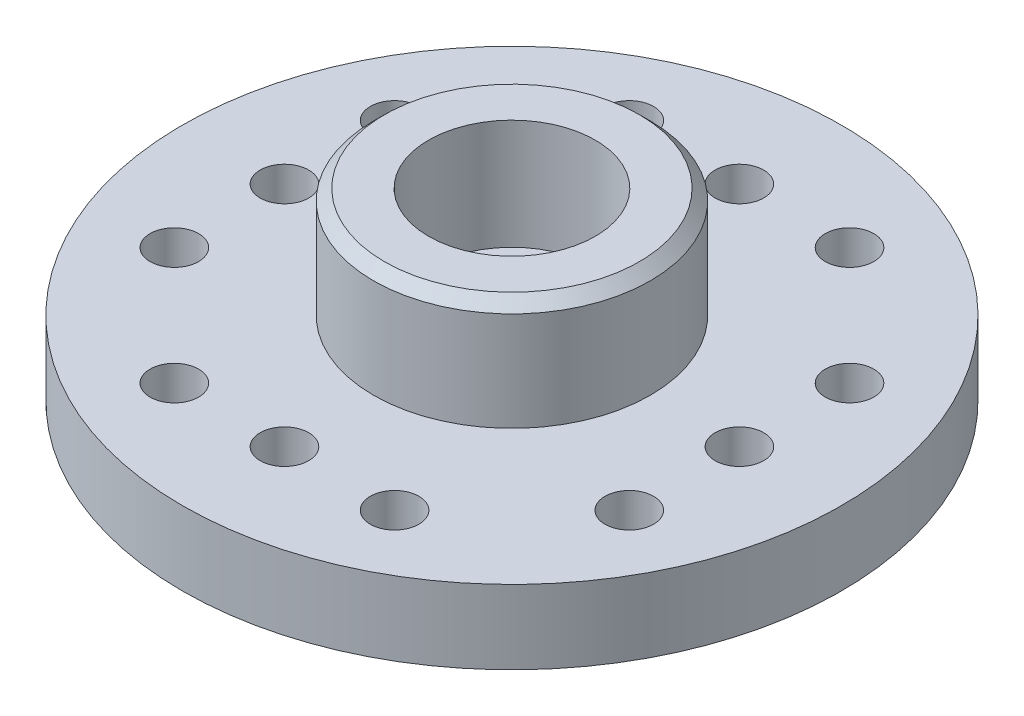
ISO-10303-21;
HEADER;
FILE_DESCRIPTION(('STEP AP214'),'2;1');
FILE_NAME('part.step','',(''),(''),'','','');
FILE_SCHEMA(('AUTOMOTIVE_DESIGN { 1 0 10303 214 1 1 1 1 }'));
ENDSEC;
DATA;
#1=APPLICATION_CONTEXT('core data for automotive mechanical design processes');
#2=APPLICATION_PROTOCOL_DEFINITION('international standard','automotive_design',2000,#1);
#3=PRODUCT_CONTEXT('',#1,'mechanical');
#4=PRODUCT('Part','Part','',(#3));
#5=PRODUCT_RELATED_PRODUCT_CATEGORY('part','',(#4));
#6=PRODUCT_DEFINITION_FORMATION('','',#4);
#7=PRODUCT_DEFINITION_CONTEXT('part definition',#1,'design');
#8=PRODUCT_DEFINITION('design','',#6,#7);
#9=PRODUCT_DEFINITION_SHAPE('','',#8);
#10=(LENGTH_UNIT() NAMED_UNIT(*) SI_UNIT(.MILLI.,.METRE.));
#11=(NAMED_UNIT(*) PLANE_ANGLE_UNIT() SI_UNIT($,.RADIAN.));
#12=(NAMED_UNIT(*) SI_UNIT($,.STERADIAN.) SOLID_ANGLE_UNIT());
#13=UNCERTAINTY_MEASURE_WITH_UNIT(LENGTH_MEASURE(1.E-05),#10,'distance_accuracy_value','');
#14=(GEOMETRIC_REPRESENTATION_CONTEXT(3) GLOBAL_UNCERTAINTY_ASSIGNED_CONTEXT((#13)) GLOBAL_UNIT_ASSIGNED_CONTEXT((#10,
#11,#12)) REPRESENTATION_CONTEXT('',''));
#15=CARTESIAN_POINT('',(0.,0.,0.));
#16=DIRECTION('',(0.,0.,1.));
#17=DIRECTION('',(1.,0.,0.));
#18=AXIS2_PLACEMENT_3D('',#15,#16,#17);
#19=CARTESIAN_POINT('',(0.,0.,0.));
#20=DIRECTION('',(0.,1.,0.));
#21=DIRECTION('',(0.,0.,1.));
#22=AXIS2_PLACEMENT_3D('',#19,#20,#21);
#23=PLANE('',#22);
#24=CARTESIAN_POINT('',(0.,0.,0.));
#25=DIRECTION('',(0.,-1.,0.));
#26=DIRECTION('',(0.,0.,-1.));
#27=AXIS2_PLACEMENT_3D('',#24,#25,#26);
#28=CIRCLE('',#27,3.);
#29=CARTESIAN_POINT('',(0.,0.,-3.));
#30=VERTEX_POINT('',#29);
#31=EDGE_CURVE('E172',#30,#30,#28,.T.);
#32=ORIENTED_EDGE('',*,*,#31,.F.);
#33=EDGE_LOOP('',(#32));
#34=FACE_BOUND('',#33,.T.);
#35=CARTESIAN_POINT('',(0.,0.,0.));
#36=DIRECTION('',(0.,-1.,0.));
#37=DIRECTION('',(0.,0.,-1.));
#38=AXIS2_PLACEMENT_3D('',#35,#36,#37);
#39=CIRCLE('',#38,3.5);
#40=CARTESIAN_POINT('',(0.,0.,-3.5));
#41=VERTEX_POINT('',#40);
#42=EDGE_CURVE('E196',#41,#41,#39,.T.);
#43=ORIENTED_EDGE('',*,*,#42,.T.);
#44=EDGE_LOOP('',(#43));
#45=FACE_BOUND('',#44,.T.);
#46=ADVANCED_FACE('F39',(#34,#45),#23,.F.);
#47=CARTESIAN_POINT('',(0.,2.35,0.));
#48=DIRECTION('',(0.,1.,0.));
#49=DIRECTION('',(0.,0.,1.));
#50=AXIS2_PLACEMENT_3D('',#47,#48,#49);
#51=PLANE('',#50);
#52=CARTESIAN_POINT('',(0.,2.35,0.));
#53=DIRECTION('',(0.,1.,0.));
#54=DIRECTION('',(0.,0.,1.));
#55=AXIS2_PLACEMENT_3D('',#52,#53,#54);
#56=CIRCLE('',#55,4.4);
#57=CARTESIAN_POINT('',(0.,2.35,4.4));
#58=VERTEX_POINT('',#57);
#59=EDGE_CURVE('E163',#58,#58,#56,.T.);
#60=ORIENTED_EDGE('',*,*,#59,.F.);
#61=EDGE_LOOP('',(#60));
#62=FACE_BOUND('',#61,.T.);
#63=CARTESIAN_POINT('',(-7.23000000000004,2.35,3.49999999999993));
#64=DIRECTION('',(0.,1.,0.));
#65=DIRECTION('',(0.,0.,1.));
#66=AXIS2_PLACEMENT_3D('',#63,#64,#65);
#67=CIRCLE('',#66,0.771713968686915);
#68=CARTESIAN_POINT('',(-7.23000000000004,2.35,4.27171396868684));
#69=VERTEX_POINT('',#68);
#70=EDGE_CURVE('E136',#69,#69,#67,.T.);
#71=ORIENTED_EDGE('',*,*,#70,.F.);
#72=EDGE_LOOP('',(#71));
#73=FACE_BOUND('',#72,.T.);
#74=CARTESIAN_POINT('',(-3.50000000000002,2.35,7.23));
#75=DIRECTION('',(0.,1.,0.));
#76=DIRECTION('',(0.,0.,-1.));
#77=AXIS2_PLACEMENT_3D('',#74,#75,#76);
#78=CIRCLE('',#77,0.771713968686915);
#79=CARTESIAN_POINT('',(-3.50000000000002,2.35,6.45828603131308));
#80=VERTEX_POINT('',#79);
#81=EDGE_CURVE('E120',#80,#80,#78,.T.);
#82=ORIENTED_EDGE('',*,*,#81,.F.);
#83=EDGE_LOOP('',(#82));
#84=FACE_BOUND('',#83,.T.);
#85=CARTESIAN_POINT('',(0.,2.35,7.23));
#86=DIRECTION('',(0.,1.,0.));
#87=DIRECTION('',(0.,0.,1.));
#88=AXIS2_PLACEMENT_3D('',#85,#86,#87);
#89=CIRCLE('',#88,0.771713968686915);
#90=CARTESIAN_POINT('',(0.,2.35,8.00171396868692));
#91=VERTEX_POINT('',#90);
#92=EDGE_CURVE('E104',#91,#91,#89,.T.);
#93=ORIENTED_EDGE('',*,*,#92,.F.);
#94=EDGE_LOOP('',(#93));
#95=FACE_BOUND('',#94,.T.);
#96=CARTESIAN_POINT('',(7.23000000000001,2.35,-3.49999999999998));
#97=DIRECTION('',(0.,1.,0.));
#98=DIRECTION('',(0.,0.,1.));
#99=AXIS2_PLACEMENT_3D('',#96,#97,#98);
#100=CIRCLE('',#99,0.771713968686915);
#101=CARTESIAN_POINT('',(7.23000000000001,2.35,-2.72828603131306));
#102=VERTEX_POINT('',#101);
#103=EDGE_CURVE('E88',#102,#102,#100,.T.);
#104=ORIENTED_EDGE('',*,*,#103,.F.);
#105=EDGE_LOOP('',(#104));
#106=FACE_BOUND('',#105,.T.);
#107=CARTESIAN_POINT('',(3.49999999999997,2.35,-7.23000000000002));
#108=DIRECTION('',(0.,1.,0.));
#109=DIRECTION('',(0.,0.,-1.));
#110=AXIS2_PLACEMENT_3D('',#107,#108,#109);
#111=CIRCLE('',#110,0.771713968686915);
#112=CARTESIAN_POINT('',(3.49999999999997,2.35,-8.00171396868694));
#113=VERTEX_POINT('',#112);
#114=EDGE_CURVE('E72',#113,#113,#111,.T.);
#115=ORIENTED_EDGE('',*,*,#114,.F.);
#116=EDGE_LOOP('',(#115));
#117=FACE_BOUND('',#116,.T.);
#118=CARTESIAN_POINT('',(0.,2.35,-7.23));
#119=DIRECTION('',(0.,1.,0.));
#120=DIRECTION('',(0.,0.,1.));
#121=AXIS2_PLACEMENT_3D('',#118,#119,#120);
#122=CIRCLE('',#121,0.771713968686916);
#123=CARTESIAN_POINT('',(0.,2.35,-6.45828603131308));
#124=VERTEX_POINT('',#123);
#125=EDGE_CURVE('E58',#124,#124,#122,.T.);
#126=ORIENTED_EDGE('',*,*,#125,.F.);
#127=EDGE_LOOP('',(#126));
#128=FACE_BOUND('',#127,.T.);
#129=CARTESIAN_POINT('',(0.,2.35,0.));
#130=DIRECTION('',(0.,1.,0.));
#131=DIRECTION('',(0.,0.,1.));
#132=AXIS2_PLACEMENT_3D('',#129,#130,#131);
#133=CIRCLE('',#132,10.475);
#134=CARTESIAN_POINT('',(0.,2.35,10.475));
#135=VERTEX_POINT('',#134);
#136=EDGE_CURVE('E47',#135,#135,#133,.T.);
#137=ORIENTED_EDGE('',*,*,#136,.T.);
#138=EDGE_LOOP('',(#137));
#139=FACE_BOUND('',#138,.T.);
#140=CARTESIAN_POINT('',(-3.5,2.35,-7.23));
#141=DIRECTION('',(0.,1.,0.));
#142=DIRECTION('',(0.,0.,1.));
#143=AXIS2_PLACEMENT_3D('',#140,#141,#142);
#144=CIRCLE('',#143,0.771713968686915);
#145=CARTESIAN_POINT('',(-3.5,2.35,-6.45828603131308));
#146=VERTEX_POINT('',#145);
#147=EDGE_CURVE('E64',#146,#146,#144,.T.);
#148=ORIENTED_EDGE('',*,*,#147,.F.);
#149=EDGE_LOOP('',(#148));
#150=FACE_BOUND('',#149,.T.);
#151=CARTESIAN_POINT('',(7.23,2.35,0.));
#152=DIRECTION('',(0.,1.,0.));
#153=DIRECTION('',(0.,0.,1.));
#154=AXIS2_PLACEMENT_3D('',#151,#152,#153);
#155=CIRCLE('',#154,0.771713968686915);
#156=CARTESIAN_POINT('',(7.23,2.35,0.771713968686937));
#157=VERTEX_POINT('',#156);
#158=EDGE_CURVE('E80',#157,#157,#155,.T.);
#159=ORIENTED_EDGE('',*,*,#158,.F.);
#160=EDGE_LOOP('',(#159));
#161=FACE_BOUND('',#160,.T.);
#162=CARTESIAN_POINT('',(7.23000000000001,2.35,3.49999999999999));
#163=DIRECTION('',(0.,1.,0.));
#164=DIRECTION('',(0.,0.,-1.));
#165=AXIS2_PLACEMENT_3D('',#162,#163,#164);
#166=CIRCLE('',#165,0.771713968686915);
#167=CARTESIAN_POINT('',(7.23000000000001,2.35,2.72828603131308));
#168=VERTEX_POINT('',#167);
#169=EDGE_CURVE('E96',#168,#168,#166,.T.);
#170=ORIENTED_EDGE('',*,*,#169,.F.);
#171=EDGE_LOOP('',(#170));
#172=FACE_BOUND('',#171,.T.);
#173=CARTESIAN_POINT('',(3.49999999999995,2.35,7.23000000000002));
#174=DIRECTION('',(0.,1.,0.));
#175=DIRECTION('',(0.,0.,1.));
#176=AXIS2_PLACEMENT_3D('',#173,#174,#175);
#177=CIRCLE('',#176,0.771713968686915);
#178=CARTESIAN_POINT('',(3.49999999999995,2.35,8.00171396868694));
#179=VERTEX_POINT('',#178);
#180=EDGE_CURVE('E112',#179,#179,#177,.T.);
#181=ORIENTED_EDGE('',*,*,#180,.F.);
#182=EDGE_LOOP('',(#181));
#183=FACE_BOUND('',#182,.T.);
#184=CARTESIAN_POINT('',(-7.23,2.35,0.));
#185=DIRECTION('',(0.,1.,0.));
#186=DIRECTION('',(0.,0.,1.));
#187=AXIS2_PLACEMENT_3D('',#184,#185,#186);
#188=CIRCLE('',#187,0.771713968686915);
#189=CARTESIAN_POINT('',(-7.23,2.35,0.771713968686843));
#190=VERTEX_POINT('',#189);
#191=EDGE_CURVE('E128',#190,#190,#188,.T.);
#192=ORIENTED_EDGE('',*,*,#191,.F.);
#193=EDGE_LOOP('',(#192));
#194=FACE_BOUND('',#193,.T.);
#195=CARTESIAN_POINT('',(-7.22999999999999,2.35,-3.50000000000005));
#196=DIRECTION('',(0.,1.,0.));
#197=DIRECTION('',(0.,0.,-1.));
#198=AXIS2_PLACEMENT_3D('',#195,#196,#197);
#199=CIRCLE('',#198,0.771713968686916);
#200=CARTESIAN_POINT('',(-7.22999999999999,2.35,-4.27171396868696));
#201=VERTEX_POINT('',#200);
#202=EDGE_CURVE('E144',#201,#201,#199,.T.);
#203=ORIENTED_EDGE('',*,*,#202,.F.);
#204=EDGE_LOOP('',(#203));
#205=FACE_BOUND('',#204,.T.);
#206=ADVANCED_FACE('F223',(#62,#73,#84,#95,#106,#117,#128,#139,#150,#161,#172,#183,#194,#205),
#51,.T.);
#207=CARTESIAN_POINT('',(0.,0.,0.));
#208=DIRECTION('',(0.,-1.,0.));
#209=DIRECTION('',(0.,0.,-1.));
#210=AXIS2_PLACEMENT_3D('',#207,#208,#209);
#211=CIRCLE('',#210,4.325);
#212=CARTESIAN_POINT('',(0.,0.,-4.325));
#213=VERTEX_POINT('',#212);
#214=EDGE_CURVE('E188',#213,#213,#211,.T.);
#215=ORIENTED_EDGE('',*,*,#214,.F.);
#216=EDGE_LOOP('',(#215));
#217=FACE_BOUND('',#216,.T.);
#218=CARTESIAN_POINT('',(0.,0.,0.));
#219=DIRECTION('',(0.,1.,0.));
#220=DIRECTION('',(0.,0.,1.));
#221=AXIS2_PLACEMENT_3D('',#218,#219,#220);
#222=CIRCLE('',#221,10.475);
#223=CARTESIAN_POINT('',(0.,0.,10.475));
#224=VERTEX_POINT('',#223);
#225=EDGE_CURVE('E52',#224,#224,#222,.T.);
#226=ORIENTED_EDGE('',*,*,#225,.F.);
#227=EDGE_LOOP('',(#226));
#228=FACE_BOUND('',#227,.T.);
#229=CARTESIAN_POINT('',(0.,0.,-7.23));
#230=DIRECTION('',(0.,1.,0.));
#231=DIRECTION('',(0.,0.,1.));
#232=AXIS2_PLACEMENT_3D('',#229,#230,#231);
#233=CIRCLE('',#232,0.771713968686916);
#234=CARTESIAN_POINT('',(0.,0.,-6.45828603131308));
#235=VERTEX_POINT('',#234);
#236=EDGE_CURVE('E60',#235,#235,#233,.T.);
#237=ORIENTED_EDGE('',*,*,#236,.T.);
#238=EDGE_LOOP('',(#237));
#239=FACE_BOUND('',#238,.T.);
#240=CARTESIAN_POINT('',(-3.5,0.,-7.23));
#241=DIRECTION('',(0.,1.,0.));
#242=DIRECTION('',(0.,0.,1.));
#243=AXIS2_PLACEMENT_3D('',#240,#241,#242);
#244=CIRCLE('',#243,0.771713968686915);
#245=CARTESIAN_POINT('',(-3.5,0.,-6.45828603131308));
#246=VERTEX_POINT('',#245);
#247=EDGE_CURVE('E68',#246,#246,#244,.T.);
#248=ORIENTED_EDGE('',*,*,#247,.T.);
#249=EDGE_LOOP('',(#248));
#250=FACE_BOUND('',#249,.T.);
#251=CARTESIAN_POINT('',(3.49999999999997,0.,-7.23000000000002));
#252=DIRECTION('',(0.,1.,0.));
#253=DIRECTION('',(0.,0.,-1.));
#254=AXIS2_PLACEMENT_3D('',#251,#252,#253);
#255=CIRCLE('',#254,0.771713968686915);
#256=CARTESIAN_POINT('',(3.49999999999997,0.,-8.00171396868694));
#257=VERTEX_POINT('',#256);
#258=EDGE_CURVE('E76',#257,#257,#255,.T.);
#259=ORIENTED_EDGE('',*,*,#258,.T.);
#260=EDGE_LOOP('',(#259));
#261=FACE_BOUND('',#260,.T.);
#262=CARTESIAN_POINT('',(7.23,0.,0.));
#263=DIRECTION('',(0.,1.,0.));
#264=DIRECTION('',(0.,0.,1.));
#265=AXIS2_PLACEMENT_3D('',#262,#263,#264);
#266=CIRCLE('',#265,0.771713968686915);
#267=CARTESIAN_POINT('',(7.23,0.,0.771713968686937));
#268=VERTEX_POINT('',#267);
#269=EDGE_CURVE('E84',#268,#268,#266,.T.);
#270=ORIENTED_EDGE('',*,*,#269,.T.);
#271=EDGE_LOOP('',(#270));
#272=FACE_BOUND('',#271,.T.);
#273=CARTESIAN_POINT('',(7.23000000000001,0.,-3.49999999999998));
#274=DIRECTION('',(0.,1.,0.));
#275=DIRECTION('',(0.,0.,1.));
#276=AXIS2_PLACEMENT_3D('',#273,#274,#275);
#277=CIRCLE('',#276,0.771713968686915);
#278=CARTESIAN_POINT('',(7.23000000000001,0.,-2.72828603131306));
#279=VERTEX_POINT('',#278);
#280=EDGE_CURVE('E92',#279,#279,#277,.T.);
#281=ORIENTED_EDGE('',*,*,#280,.T.);
#282=EDGE_LOOP('',(#281));
#283=FACE_BOUND('',#282,.T.);
#284=CARTESIAN_POINT('',(7.23000000000001,0.,3.49999999999999));
#285=DIRECTION('',(0.,1.,0.));
#286=DIRECTION('',(0.,0.,-1.));
#287=AXIS2_PLACEMENT_3D('',#284,#285,#286);
#288=CIRCLE('',#287,0.771713968686915);
#289=CARTESIAN_POINT('',(7.23000000000001,0.,2.72828603131308));
#290=VERTEX_POINT('',#289);
#291=EDGE_CURVE('E100',#290,#290,#288,.T.);
#292=ORIENTED_EDGE('',*,*,#291,.T.);
#293=EDGE_LOOP('',(#292));
#294=FACE_BOUND('',#293,.T.);
#295=CARTESIAN_POINT('',(0.,0.,7.23));
#296=DIRECTION('',(0.,1.,0.));
#297=DIRECTION('',(0.,0.,1.));
#298=AXIS2_PLACEMENT_3D('',#295,#296,#297);
#299=CIRCLE('',#298,0.771713968686915);
#300=CARTESIAN_POINT('',(0.,0.,8.00171396868692));
#301=VERTEX_POINT('',#300);
#302=EDGE_CURVE('E108',#301,#301,#299,.T.);
#303=ORIENTED_EDGE('',*,*,#302,.T.);
#304=EDGE_LOOP('',(#303));
#305=FACE_BOUND('',#304,.T.);
#306=CARTESIAN_POINT('',(3.49999999999995,0.,7.23000000000002));
#307=DIRECTION('',(0.,1.,0.));
#308=DIRECTION('',(0.,0.,1.));
#309=AXIS2_PLACEMENT_3D('',#306,#307,#308);
#310=CIRCLE('',#309,0.771713968686915);
#311=CARTESIAN_POINT('',(3.49999999999995,0.,8.00171396868694));
#312=VERTEX_POINT('',#311);
#313=EDGE_CURVE('E116',#312,#312,#310,.T.);
#314=ORIENTED_EDGE('',*,*,#313,.T.);
#315=EDGE_LOOP('',(#314));
#316=FACE_BOUND('',#315,.T.);
#317=CARTESIAN_POINT('',(-3.50000000000002,0.,7.23));
#318=DIRECTION('',(0.,1.,0.));
#319=DIRECTION('',(0.,0.,-1.));
#320=AXIS2_PLACEMENT_3D('',#317,#318,#319);
#321=CIRCLE('',#320,0.771713968686915);
#322=CARTESIAN_POINT('',(-3.50000000000002,0.,6.45828603131308));
#323=VERTEX_POINT('',#322);
#324=EDGE_CURVE('E124',#323,#323,#321,.T.);
#325=ORIENTED_EDGE('',*,*,#324,.T.);
#326=EDGE_LOOP('',(#325));
#327=FACE_BOUND('',#326,.T.);
#328=CARTESIAN_POINT('',(-7.23,0.,0.));
#329=DIRECTION('',(0.,1.,0.));
#330=DIRECTION('',(0.,0.,1.));
#331=AXIS2_PLACEMENT_3D('',#328,#329,#330);
#332=CIRCLE('',#331,0.771713968686915);
#333=CARTESIAN_POINT('',(-7.23,0.,0.771713968686843));
#334=VERTEX_POINT('',#333);
#335=EDGE_CURVE('E132',#334,#334,#332,.T.);
#336=ORIENTED_EDGE('',*,*,#335,.T.);
#337=EDGE_LOOP('',(#336));
#338=FACE_BOUND('',#337,.T.);
#339=CARTESIAN_POINT('',(-7.23000000000004,0.,3.49999999999993));
#340=DIRECTION('',(0.,1.,0.));
#341=DIRECTION('',(0.,0.,1.));
#342=AXIS2_PLACEMENT_3D('',#339,#340,#341);
#343=CIRCLE('',#342,0.771713968686915);
#344=CARTESIAN_POINT('',(-7.23000000000004,0.,4.27171396868684));
#345=VERTEX_POINT('',#344);
#346=EDGE_CURVE('E140',#345,#345,#343,.T.);
#347=ORIENTED_EDGE('',*,*,#346,.T.);
#348=EDGE_LOOP('',(#347));
#349=FACE_BOUND('',#348,.T.);
#350=CARTESIAN_POINT('',(-7.22999999999999,0.,-3.50000000000005));
#351=DIRECTION('',(0.,1.,0.));
#352=DIRECTION('',(0.,0.,-1.));
#353=AXIS2_PLACEMENT_3D('',#350,#351,#352);
#354=CIRCLE('',#353,0.771713968686916);
#355=CARTESIAN_POINT('',(-7.22999999999999,0.,-4.27171396868696));
#356=VERTEX_POINT('',#355);
#357=EDGE_CURVE('E148',#356,#356,#354,.T.);
#358=ORIENTED_EDGE('',*,*,#357,.T.);
#359=EDGE_LOOP('',(#358));
#360=FACE_BOUND('',#359,.T.);
#361=ADVANCED_FACE('F220',(#217,#228,#239,#250,#261,#272,#283,#294,#305,#316,#327,#338,#349,
#360),#23,.F.);
#362=CARTESIAN_POINT('',(0.,2.35,0.));
#363=DIRECTION('',(0.,-1.,0.));
#364=DIRECTION('',(0.,0.,-1.));
#365=AXIS2_PLACEMENT_3D('',#362,#363,#364);
#366=CYLINDRICAL_SURFACE('',#365,10.475);
#367=ORIENTED_EDGE('',*,*,#136,.F.);
#368=EDGE_LOOP('',(#367));
#369=FACE_BOUND('',#368,.T.);
#370=ORIENTED_EDGE('',*,*,#225,.T.);
#371=EDGE_LOOP('',(#370));
#372=FACE_BOUND('',#371,.T.);
#373=ADVANCED_FACE('F41',(#369,#372),#366,.T.);
#374=CARTESIAN_POINT('',(0.,2.35,-7.23));
#375=DIRECTION('',(0.,-1.,0.));
#376=DIRECTION('',(0.,0.,-1.));
#377=AXIS2_PLACEMENT_3D('',#374,#375,#376);
#378=CYLINDRICAL_SURFACE('',#377,0.771713968686916);
#379=ORIENTED_EDGE('',*,*,#125,.T.);
#380=EDGE_LOOP('',(#379));
#381=FACE_BOUND('',#380,.T.);
#382=ORIENTED_EDGE('',*,*,#236,.F.);
#383=EDGE_LOOP('',(#382));
#384=FACE_BOUND('',#383,.T.);
#385=ADVANCED_FACE('F278',(#381,#384),#378,.F.);
#386=CARTESIAN_POINT('',(-3.5,2.35,-7.23));
#387=DIRECTION('',(0.,-1.,0.));
#388=DIRECTION('',(0.,0.,-1.));
#389=AXIS2_PLACEMENT_3D('',#386,#387,#388);
#390=CYLINDRICAL_SURFACE('',#389,0.771713968686915);
#391=ORIENTED_EDGE('',*,*,#147,.T.);
#392=EDGE_LOOP('',(#391));
#393=FACE_BOUND('',#392,.T.);
#394=ORIENTED_EDGE('',*,*,#247,.F.);
#395=EDGE_LOOP('',(#394));
#396=FACE_BOUND('',#395,.T.);
#397=ADVANCED_FACE('F281',(#393,#396),#390,.F.);
#398=CARTESIAN_POINT('',(3.49999999999997,2.35,-7.23000000000002));
#399=DIRECTION('',(0.,-1.,0.));
#400=DIRECTION('',(0.,0.,-1.));
#401=AXIS2_PLACEMENT_3D('',#398,#399,#400);
#402=CYLINDRICAL_SURFACE('',#401,0.771713968686915);
#403=ORIENTED_EDGE('',*,*,#114,.T.);
#404=EDGE_LOOP('',(#403));
#405=FACE_BOUND('',#404,.T.);
#406=ORIENTED_EDGE('',*,*,#258,.F.);
#407=EDGE_LOOP('',(#406));
#408=FACE_BOUND('',#407,.T.);
#409=ADVANCED_FACE('F285',(#405,#408),#402,.F.);
#410=CARTESIAN_POINT('',(7.23,2.35,0.));
#411=DIRECTION('',(0.,-1.,0.));
#412=DIRECTION('',(0.,0.,-1.));
#413=AXIS2_PLACEMENT_3D('',#410,#411,#412);
#414=CYLINDRICAL_SURFACE('',#413,0.771713968686915);
#415=ORIENTED_EDGE('',*,*,#158,.T.);
#416=EDGE_LOOP('',(#415));
#417=FACE_BOUND('',#416,.T.);
#418=ORIENTED_EDGE('',*,*,#269,.F.);
#419=EDGE_LOOP('',(#418));
#420=FACE_BOUND('',#419,.T.);
#421=ADVANCED_FACE('F289',(#417,#420),#414,.F.);
#422=CARTESIAN_POINT('',(7.23000000000001,2.35,-3.49999999999998));
#423=DIRECTION('',(0.,-1.,0.));
#424=DIRECTION('',(0.,0.,-1.));
#425=AXIS2_PLACEMENT_3D('',#422,#423,#424);
#426=CYLINDRICAL_SURFACE('',#425,0.771713968686915);
#427=ORIENTED_EDGE('',*,*,#103,.T.);
#428=EDGE_LOOP('',(#427));
#429=FACE_BOUND('',#428,.T.);
#430=ORIENTED_EDGE('',*,*,#280,.F.);
#431=EDGE_LOOP('',(#430));
#432=FACE_BOUND('',#431,.T.);
#433=ADVANCED_FACE('F293',(#429,#432),#426,.F.);
#434=CARTESIAN_POINT('',(7.23000000000001,2.35,3.49999999999999));
#435=DIRECTION('',(0.,-1.,0.));
#436=DIRECTION('',(0.,0.,-1.));
#437=AXIS2_PLACEMENT_3D('',#434,#435,#436);
#438=CYLINDRICAL_SURFACE('',#437,0.771713968686915);
#439=ORIENTED_EDGE('',*,*,#169,.T.);
#440=EDGE_LOOP('',(#439));
#441=FACE_BOUND('',#440,.T.);
#442=ORIENTED_EDGE('',*,*,#291,.F.);
#443=EDGE_LOOP('',(#442));
#444=FACE_BOUND('',#443,.T.);
#445=ADVANCED_FACE('F297',(#441,#444),#438,.F.);
#446=CARTESIAN_POINT('',(0.,2.35,7.23));
#447=DIRECTION('',(0.,-1.,0.));
#448=DIRECTION('',(0.,0.,-1.));
#449=AXIS2_PLACEMENT_3D('',#446,#447,#448);
#450=CYLINDRICAL_SURFACE('',#449,0.771713968686915);
#451=ORIENTED_EDGE('',*,*,#92,.T.);
#452=EDGE_LOOP('',(#451));
#453=FACE_BOUND('',#452,.T.);
#454=ORIENTED_EDGE('',*,*,#302,.F.);
#455=EDGE_LOOP('',(#454));
#456=FACE_BOUND('',#455,.T.);
#457=ADVANCED_FACE('F301',(#453,#456),#450,.F.);
#458=CARTESIAN_POINT('',(3.49999999999995,2.35,7.23000000000002));
#459=DIRECTION('',(0.,-1.,0.));
#460=DIRECTION('',(0.,0.,-1.));
#461=AXIS2_PLACEMENT_3D('',#458,#459,#460);
#462=CYLINDRICAL_SURFACE('',#461,0.771713968686915);
#463=ORIENTED_EDGE('',*,*,#180,.T.);
#464=EDGE_LOOP('',(#463));
#465=FACE_BOUND('',#464,.T.);
#466=ORIENTED_EDGE('',*,*,#313,.F.);
#467=EDGE_LOOP('',(#466));
#468=FACE_BOUND('',#467,.T.);
#469=ADVANCED_FACE('F305',(#465,#468),#462,.F.);
#470=CARTESIAN_POINT('',(-3.50000000000002,2.35,7.23));
#471=DIRECTION('',(0.,-1.,0.));
#472=DIRECTION('',(0.,0.,-1.));
#473=AXIS2_PLACEMENT_3D('',#470,#471,#472);
#474=CYLINDRICAL_SURFACE('',#473,0.771713968686915);
#475=ORIENTED_EDGE('',*,*,#81,.T.);
#476=EDGE_LOOP('',(#475));
#477=FACE_BOUND('',#476,.T.);
#478=ORIENTED_EDGE('',*,*,#324,.F.);
#479=EDGE_LOOP('',(#478));
#480=FACE_BOUND('',#479,.T.);
#481=ADVANCED_FACE('F309',(#477,#480),#474,.F.);
#482=CARTESIAN_POINT('',(-7.23,2.35,0.));
#483=DIRECTION('',(0.,-1.,0.));
#484=DIRECTION('',(0.,0.,-1.));
#485=AXIS2_PLACEMENT_3D('',#482,#483,#484);
#486=CYLINDRICAL_SURFACE('',#485,0.771713968686915);
#487=ORIENTED_EDGE('',*,*,#191,.T.);
#488=EDGE_LOOP('',(#487));
#489=FACE_BOUND('',#488,.T.);
#490=ORIENTED_EDGE('',*,*,#335,.F.);
#491=EDGE_LOOP('',(#490));
#492=FACE_BOUND('',#491,.T.);
#493=ADVANCED_FACE('F263',(#489,#492),#486,.F.);
#494=CARTESIAN_POINT('',(-7.23000000000004,2.35,3.49999999999993));
#495=DIRECTION('',(0.,-1.,0.));
#496=DIRECTION('',(0.,0.,-1.));
#497=AXIS2_PLACEMENT_3D('',#494,#495,#496);
#498=CYLINDRICAL_SURFACE('',#497,0.771713968686915);
#499=ORIENTED_EDGE('',*,*,#70,.T.);
#500=EDGE_LOOP('',(#499));
#501=FACE_BOUND('',#500,.T.);
#502=ORIENTED_EDGE('',*,*,#346,.F.);
#503=EDGE_LOOP('',(#502));
#504=FACE_BOUND('',#503,.T.);
#505=ADVANCED_FACE('F253',(#501,#504),#498,.F.);
#506=CARTESIAN_POINT('',(-7.22999999999999,2.35,-3.50000000000005));
#507=DIRECTION('',(0.,-1.,0.));
#508=DIRECTION('',(0.,0.,-1.));
#509=AXIS2_PLACEMENT_3D('',#506,#507,#508);
#510=CYLINDRICAL_SURFACE('',#509,0.771713968686916);
#511=ORIENTED_EDGE('',*,*,#202,.T.);
#512=EDGE_LOOP('',(#511));
#513=FACE_BOUND('',#512,.T.);
#514=ORIENTED_EDGE('',*,*,#357,.F.);
#515=EDGE_LOOP('',(#514));
#516=FACE_BOUND('',#515,.T.);
#517=ADVANCED_FACE('F250',(#513,#516),#510,.F.);
#518=CARTESIAN_POINT('',(0.,5.85,0.));
#519=DIRECTION('',(0.,1.,0.));
#520=DIRECTION('',(0.,0.,1.));
#521=AXIS2_PLACEMENT_3D('',#518,#519,#520);
#522=PLANE('',#521);
#523=CARTESIAN_POINT('',(0.,5.85,0.));
#524=DIRECTION('',(0.,1.,0.));
#525=DIRECTION('',(0.,0.,1.));
#526=AXIS2_PLACEMENT_3D('',#523,#524,#525);
#527=CIRCLE('',#526,4.05);
#528=CARTESIAN_POINT('',(0.,5.85,-4.05));
#529=VERTEX_POINT('',#528);
#530=EDGE_CURVE('E159',#529,#529,#527,.T.);
#531=ORIENTED_EDGE('',*,*,#530,.T.);
#532=EDGE_LOOP('',(#531));
#533=FACE_BOUND('',#532,.T.);
#534=CARTESIAN_POINT('',(0.,5.85,0.));
#535=DIRECTION('',(0.,1.,0.));
#536=DIRECTION('',(0.,0.,1.));
#537=AXIS2_PLACEMENT_3D('',#534,#535,#536);
#538=CIRCLE('',#537,2.65);
#539=CARTESIAN_POINT('',(0.,5.85,2.65));
#540=VERTEX_POINT('',#539);
#541=EDGE_CURVE('E167',#540,#540,#538,.T.);
#542=ORIENTED_EDGE('',*,*,#541,.F.);
#543=EDGE_LOOP('',(#542));
#544=FACE_BOUND('',#543,.T.);
#545=ADVANCED_FACE('F252',(#533,#544),#522,.T.);
#546=CARTESIAN_POINT('',(0.,5.85,0.));
#547=DIRECTION('',(0.,-1.,0.));
#548=DIRECTION('',(0.,0.,-1.));
#549=AXIS2_PLACEMENT_3D('',#546,#547,#548);
#550=CYLINDRICAL_SURFACE('',#549,4.4);
#551=CARTESIAN_POINT('',(0.,5.5,0.));
#552=DIRECTION('',(0.,1.,0.));
#553=DIRECTION('',(0.,0.,1.));
#554=AXIS2_PLACEMENT_3D('',#551,#552,#553);
#555=CIRCLE('',#554,4.4);
#556=CARTESIAN_POINT('',(0.,5.5,-4.4));
#557=VERTEX_POINT('',#556);
#558=EDGE_CURVE('E152',#557,#557,#555,.F.);
#559=ORIENTED_EDGE('',*,*,#558,.T.);
#560=EDGE_LOOP('',(#559));
#561=FACE_BOUND('',#560,.T.);
#562=ORIENTED_EDGE('',*,*,#59,.T.);
#563=EDGE_LOOP('',(#562));
#564=FACE_BOUND('',#563,.T.);
#565=ADVANCED_FACE('F260',(#561,#564),#550,.T.);
#566=CARTESIAN_POINT('',(0.,5.85,0.));
#567=DIRECTION('',(0.,-1.,0.));
#568=DIRECTION('',(0.,0.,-1.));
#569=AXIS2_PLACEMENT_3D('',#566,#567,#568);
#570=CYLINDRICAL_SURFACE('',#569,2.65);
#571=ORIENTED_EDGE('',*,*,#541,.T.);
#572=EDGE_LOOP('',(#571));
#573=FACE_BOUND('',#572,.T.);
#574=CARTESIAN_POINT('',(0.,2.35,0.));
#575=DIRECTION('',(0.,1.,0.));
#576=DIRECTION('',(0.,0.,1.));
#577=AXIS2_PLACEMENT_3D('',#574,#575,#576);
#578=CIRCLE('',#577,2.65);
#579=CARTESIAN_POINT('',(0.,2.35,2.65));
#580=VERTEX_POINT('',#579);
#581=EDGE_CURVE('E10',#580,#580,#578,.F.);
#582=ORIENTED_EDGE('',*,*,#581,.T.);
#583=EDGE_LOOP('',(#582));
#584=FACE_BOUND('',#583,.T.);
#585=ADVANCED_FACE('F358',(#573,#584),#570,.F.);
#586=CARTESIAN_POINT('',(0.,5.85,0.));
#587=DIRECTION('',(0.,-1.,0.));
#588=DIRECTION('',(0.,0.,-1.));
#589=AXIS2_PLACEMENT_3D('',#586,#587,#588);
#590=CONICAL_SURFACE('',#589,4.05,0.785398163397447);
#591=CARTESIAN_POINT('',(0.,5.5,-4.4));
#592=CARTESIAN_POINT('',(0.,5.50364583333333,-4.39635416666667));
#593=CARTESIAN_POINT('',(0.,5.50729166666667,-4.39270833333334));
#594=CARTESIAN_POINT('',(0.,5.51458333333333,-4.38541666666667));
#595=CARTESIAN_POINT('',(0.,5.51822916666667,-4.38177083333334));
#596=CARTESIAN_POINT('',(0.,5.52552083333333,-4.37447916666667));
#597=CARTESIAN_POINT('',(0.,5.52916666666667,-4.37083333333334));
#598=CARTESIAN_POINT('',(0.,5.53645833333333,-4.36354166666667));
#599=CARTESIAN_POINT('',(0.,5.54010416666667,-4.35989583333334));
#600=CARTESIAN_POINT('',(0.,5.54739583333333,-4.35260416666667));
#601=CARTESIAN_POINT('',(0.,5.55104166666667,-4.34895833333334));
#602=CARTESIAN_POINT('',(0.,5.55833333333333,-4.34166666666667));
#603=CARTESIAN_POINT('',(0.,5.56197916666667,-4.33802083333334));
#604=CARTESIAN_POINT('',(0.,5.56927083333333,-4.33072916666667));
#605=CARTESIAN_POINT('',(0.,5.57291666666667,-4.32708333333334));
#606=CARTESIAN_POINT('',(0.,5.58020833333333,-4.31979166666667));
#607=CARTESIAN_POINT('',(0.,5.58385416666667,-4.31614583333334));
#608=CARTESIAN_POINT('',(0.,5.59114583333333,-4.30885416666667));
#609=CARTESIAN_POINT('',(0.,5.59479166666667,-4.30520833333334));
#610=CARTESIAN_POINT('',(0.,5.60208333333333,-4.29791666666667));
#611=CARTESIAN_POINT('',(0.,5.60572916666667,-4.29427083333334));
#612=CARTESIAN_POINT('',(0.,5.61302083333333,-4.28697916666667));
#613=CARTESIAN_POINT('',(0.,5.61666666666667,-4.28333333333334));
#614=CARTESIAN_POINT('',(0.,5.62395833333333,-4.27604166666667));
#615=CARTESIAN_POINT('',(0.,5.62760416666667,-4.27239583333334));
#616=CARTESIAN_POINT('',(0.,5.63489583333333,-4.26510416666667));
#617=CARTESIAN_POINT('',(0.,5.63854166666667,-4.26145833333334));
#618=CARTESIAN_POINT('',(0.,5.64583333333333,-4.25416666666667));
#619=CARTESIAN_POINT('',(0.,5.64947916666667,-4.25052083333334));
#620=CARTESIAN_POINT('',(0.,5.65677083333333,-4.24322916666667));
#621=CARTESIAN_POINT('',(0.,5.66041666666667,-4.23958333333334));
#622=CARTESIAN_POINT('',(0.,5.66770833333333,-4.23229166666667));
#623=CARTESIAN_POINT('',(0.,5.67135416666667,-4.22864583333334));
#624=CARTESIAN_POINT('',(0.,5.67864583333333,-4.22135416666667));
#625=CARTESIAN_POINT('',(0.,5.68229166666667,-4.21770833333334));
#626=CARTESIAN_POINT('',(0.,5.68958333333333,-4.21041666666667));
#627=CARTESIAN_POINT('',(0.,5.69322916666667,-4.20677083333334));
#628=CARTESIAN_POINT('',(0.,5.70052083333333,-4.19947916666667));
#629=CARTESIAN_POINT('',(0.,5.70416666666667,-4.19583333333334));
#630=CARTESIAN_POINT('',(0.,5.71145833333333,-4.18854166666667));
#631=CARTESIAN_POINT('',(0.,5.71510416666667,-4.18489583333334));
#632=CARTESIAN_POINT('',(0.,5.72239583333333,-4.17760416666667));
#633=CARTESIAN_POINT('',(0.,5.72604166666667,-4.17395833333334));
#634=CARTESIAN_POINT('',(0.,5.73333333333333,-4.16666666666667));
#635=CARTESIAN_POINT('',(0.,5.73697916666667,-4.16302083333334));
#636=CARTESIAN_POINT('',(0.,5.74427083333333,-4.15572916666667));
#637=CARTESIAN_POINT('',(0.,5.74791666666667,-4.15208333333334));
#638=CARTESIAN_POINT('',(0.,5.75520833333333,-4.14479166666667));
#639=CARTESIAN_POINT('',(0.,5.75885416666667,-4.14114583333334));
#640=CARTESIAN_POINT('',(0.,5.76614583333333,-4.13385416666667));
#641=CARTESIAN_POINT('',(0.,5.76979166666667,-4.13020833333334));
#642=CARTESIAN_POINT('',(0.,5.77708333333333,-4.12291666666667));
#643=CARTESIAN_POINT('',(0.,5.78072916666667,-4.11927083333334));
#644=CARTESIAN_POINT('',(0.,5.78802083333333,-4.11197916666667));
#645=CARTESIAN_POINT('',(0.,5.79166666666667,-4.10833333333334));
#646=CARTESIAN_POINT('',(0.,5.79895833333333,-4.10104166666667));
#647=CARTESIAN_POINT('',(0.,5.80260416666667,-4.09739583333334));
#648=CARTESIAN_POINT('',(0.,5.80989583333333,-4.09010416666667));
#649=CARTESIAN_POINT('',(0.,5.81354166666667,-4.08645833333334));
#650=CARTESIAN_POINT('',(0.,5.82083333333333,-4.07916666666667));
#651=CARTESIAN_POINT('',(0.,5.82447916666667,-4.07552083333334));
#652=CARTESIAN_POINT('',(0.,5.83177083333333,-4.06822916666667));
#653=CARTESIAN_POINT('',(0.,5.83541666666667,-4.06458333333334));
#654=CARTESIAN_POINT('',(0.,5.84270833333333,-4.05729166666667));
#655=CARTESIAN_POINT('',(0.,5.84635416666667,-4.05364583333334));
#656=CARTESIAN_POINT('',(0.,5.85,-4.05));
#657=B_SPLINE_CURVE_WITH_KNOTS('',3,(#591,#592,#593,#594,#595,#596,#597,#598,#599,#600,#601,
#602,#603,#604,#605,#606,#607,#608,#609,#610,#611,#612,#613,#614,#615,#616,#617,#618,#619,#620,
#621,#622,#623,#624,#625,#626,#627,#628,#629,#630,#631,#632,#633,#634,#635,#636,#637,#638,#639,
#640,#641,#642,#643,#644,#645,#646,#647,#648,#649,#650,#651,#652,#653,#654,#655,#656),
.UNSPECIFIED.,.F.,.F.,(4,2,2,2,2,2,2,2,2,2,2,2,2,2,2,2,2,2,2,2,2,2,2,2,2,2,2,2,2,2,2,2,4),(0.,
0.0154679608384559,0.0309359216769111,0.0464038825153676,0.0618718433538228,0.0773398041922781,
0.0928077650307346,0.10827572586919,0.123743686707646,0.139211647546102,0.154679608384557,
0.170147569223013,0.185615530061469,0.201083490899924,0.21655145173838,0.232019412576836,
0.247487373415291,0.262955334253747,0.278423295092202,0.293891255930658,0.309359216769114,
0.324827177607569,0.340295138446025,0.355763099284481,0.371231060122937,0.386699020961392,
0.402166981799848,0.417634942638304,0.433102903476759,0.448570864315215,0.464038825153671,
0.479506785992126,0.494974746830583),.UNSPECIFIED.);
#658=EDGE_CURVE('BSEAM368',#557,#529,#657,.T.);
#659=ORIENTED_EDGE('',*,*,#558,.F.);
#660=ORIENTED_EDGE('',*,*,#530,.F.);
#661=ORIENTED_EDGE('',*,*,#658,.T.);
#662=ORIENTED_EDGE('',*,*,#658,.F.);
#663=EDGE_LOOP('',(#659,#661,#660,#662));
#664=FACE_BOUND('',#663,.T.);
#665=ADVANCED_FACE('F368',(#664),#590,.T.);
#666=CARTESIAN_POINT('',(0.,2.35,0.));
#667=DIRECTION('',(0.,1.,0.));
#668=DIRECTION('',(0.,0.,1.));
#669=AXIS2_PLACEMENT_3D('',#666,#667,#668);
#670=CIRCLE('',#669,1.425);
#671=CARTESIAN_POINT('',(0.,2.35,1.425));
#672=VERTEX_POINT('',#671);
#673=EDGE_CURVE('E180',#672,#672,#670,.T.);
#674=ORIENTED_EDGE('',*,*,#673,.F.);
#675=EDGE_LOOP('',(#674));
#676=FACE_BOUND('',#675,.T.);
#677=ORIENTED_EDGE('',*,*,#581,.F.);
#678=EDGE_LOOP('',(#677));
#679=FACE_BOUND('',#678,.T.);
#680=ADVANCED_FACE('F274',(#676,#679),#51,.T.);
#681=CARTESIAN_POINT('',(0.,1.,0.));
#682=DIRECTION('',(0.,-1.,0.));
#683=DIRECTION('',(0.,0.,-1.));
#684=AXIS2_PLACEMENT_3D('',#681,#682,#683);
#685=CYLINDRICAL_SURFACE('',#684,3.);
#686=CARTESIAN_POINT('',(0.,1.,0.));
#687=DIRECTION('',(0.,-1.,0.));
#688=DIRECTION('',(0.,0.,-1.));
#689=AXIS2_PLACEMENT_3D('',#686,#687,#688);
#690=CIRCLE('',#689,3.);
#691=CARTESIAN_POINT('',(0.,1.,-3.));
#692=VERTEX_POINT('',#691);
#693=EDGE_CURVE('E171',#692,#692,#690,.T.);
#694=ORIENTED_EDGE('',*,*,#693,.F.);
#695=EDGE_LOOP('',(#694));
#696=FACE_BOUND('',#695,.T.);
#697=ORIENTED_EDGE('',*,*,#31,.T.);
#698=EDGE_LOOP('',(#697));
#699=FACE_BOUND('',#698,.T.);
#700=ADVANCED_FACE('F382',(#696,#699),#685,.F.);
#701=CARTESIAN_POINT('',(0.,1.,0.));
#702=DIRECTION('',(0.,-1.,0.));
#703=DIRECTION('',(0.,0.,-1.));
#704=AXIS2_PLACEMENT_3D('',#701,#702,#703);
#705=PLANE('',#704);
#706=CARTESIAN_POINT('',(0.,1.,0.));
#707=DIRECTION('',(0.,1.,0.));
#708=DIRECTION('',(0.,0.,1.));
#709=AXIS2_PLACEMENT_3D('',#706,#707,#708);
#710=CIRCLE('',#709,1.425);
#711=CARTESIAN_POINT('',(0.,1.,1.425));
#712=VERTEX_POINT('',#711);
#713=EDGE_CURVE('E176',#712,#712,#710,.T.);
#714=ORIENTED_EDGE('',*,*,#713,.T.);
#715=EDGE_LOOP('',(#714));
#716=FACE_BOUND('',#715,.T.);
#717=ORIENTED_EDGE('',*,*,#693,.T.);
#718=EDGE_LOOP('',(#717));
#719=FACE_BOUND('',#718,.T.);
#720=ADVANCED_FACE('F387',(#716,#719),#705,.T.);
#721=CARTESIAN_POINT('',(0.,1.,0.));
#722=DIRECTION('',(0.,1.,0.));
#723=DIRECTION('',(0.,0.,1.));
#724=AXIS2_PLACEMENT_3D('',#721,#722,#723);
#725=CYLINDRICAL_SURFACE('',#724,1.425);
#726=CARTESIAN_POINT('',(0.,1.,1.425));
#727=CARTESIAN_POINT('',(0.,1.0140625,1.425));
#728=CARTESIAN_POINT('',(0.,1.028125,1.425));
#729=CARTESIAN_POINT('',(0.,1.05625,1.425));
#730=CARTESIAN_POINT('',(0.,1.0703125,1.425));
#731=CARTESIAN_POINT('',(0.,1.0984375,1.425));
#732=CARTESIAN_POINT('',(0.,1.1125,1.425));
#733=CARTESIAN_POINT('',(0.,1.140625,1.425));
#734=CARTESIAN_POINT('',(0.,1.1546875,1.425));
#735=CARTESIAN_POINT('',(0.,1.1828125,1.425));
#736=CARTESIAN_POINT('',(0.,1.196875,1.425));
#737=CARTESIAN_POINT('',(0.,1.225,1.425));
#738=CARTESIAN_POINT('',(0.,1.2390625,1.425));
#739=CARTESIAN_POINT('',(0.,1.2671875,1.425));
#740=CARTESIAN_POINT('',(0.,1.28125,1.425));
#741=CARTESIAN_POINT('',(0.,1.309375,1.425));
#742=CARTESIAN_POINT('',(0.,1.3234375,1.425));
#743=CARTESIAN_POINT('',(0.,1.3515625,1.425));
#744=CARTESIAN_POINT('',(0.,1.365625,1.425));
#745=CARTESIAN_POINT('',(0.,1.39375,1.425));
#746=CARTESIAN_POINT('',(0.,1.4078125,1.425));
#747=CARTESIAN_POINT('',(0.,1.4359375,1.425));
#748=CARTESIAN_POINT('',(0.,1.45,1.425));
#749=CARTESIAN_POINT('',(0.,1.478125,1.425));
#750=CARTESIAN_POINT('',(0.,1.4921875,1.425));
#751=CARTESIAN_POINT('',(0.,1.5203125,1.425));
#752=CARTESIAN_POINT('',(0.,1.534375,1.425));
#753=CARTESIAN_POINT('',(0.,1.5625,1.425));
#754=CARTESIAN_POINT('',(0.,1.5765625,1.425));
#755=CARTESIAN_POINT('',(0.,1.6046875,1.425));
#756=CARTESIAN_POINT('',(0.,1.61875,1.425));
#757=CARTESIAN_POINT('',(0.,1.646875,1.425));
#758=CARTESIAN_POINT('',(0.,1.6609375,1.425));
#759=CARTESIAN_POINT('',(0.,1.6890625,1.425));
#760=CARTESIAN_POINT('',(0.,1.703125,1.425));
#761=CARTESIAN_POINT('',(0.,1.73125,1.425));
#762=CARTESIAN_POINT('',(0.,1.7453125,1.425));
#763=CARTESIAN_POINT('',(0.,1.7734375,1.425));
#764=CARTESIAN_POINT('',(0.,1.7875,1.425));
#765=CARTESIAN_POINT('',(0.,1.815625,1.425));
#766=CARTESIAN_POINT('',(0.,1.8296875,1.425));
#767=CARTESIAN_POINT('',(0.,1.8578125,1.425));
#768=CARTESIAN_POINT('',(0.,1.871875,1.425));
#769=CARTESIAN_POINT('',(0.,1.9,1.425));
#770=CARTESIAN_POINT('',(0.,1.9140625,1.425));
#771=CARTESIAN_POINT('',(0.,1.9421875,1.425));
#772=CARTESIAN_POINT('',(0.,1.95625,1.425));
#773=CARTESIAN_POINT('',(0.,1.984375,1.425));
#774=CARTESIAN_POINT('',(0.,1.9984375,1.425));
#775=CARTESIAN_POINT('',(0.,2.0265625,1.425));
#776=CARTESIAN_POINT('',(0.,2.040625,1.425));
#777=CARTESIAN_POINT('',(0.,2.06875,1.425));
#778=CARTESIAN_POINT('',(0.,2.0828125,1.425));
#779=CARTESIAN_POINT('',(0.,2.1109375,1.425));
#780=CARTESIAN_POINT('',(0.,2.125,1.425));
#781=CARTESIAN_POINT('',(0.,2.153125,1.425));
#782=CARTESIAN_POINT('',(0.,2.1671875,1.425));
#783=CARTESIAN_POINT('',(0.,2.1953125,1.425));
#784=CARTESIAN_POINT('',(0.,2.209375,1.425));
#785=CARTESIAN_POINT('',(0.,2.2375,1.425));
#786=CARTESIAN_POINT('',(0.,2.2515625,1.425));
#787=CARTESIAN_POINT('',(0.,2.2796875,1.425));
#788=CARTESIAN_POINT('',(0.,2.29375,1.425));
#789=CARTESIAN_POINT('',(0.,2.321875,1.425));
#790=CARTESIAN_POINT('',(0.,2.3359375,1.425));
#791=CARTESIAN_POINT('',(0.,2.35,1.425));
#792=B_SPLINE_CURVE_WITH_KNOTS('',3,(#726,#727,#728,#729,#730,#731,#732,#733,#734,#735,#736,
#737,#738,#739,#740,#741,#742,#743,#744,#745,#746,#747,#748,#749,#750,#751,#752,#753,#754,#755,
#756,#757,#758,#759,#760,#761,#762,#763,#764,#765,#766,#767,#768,#769,#770,#771,#772,#773,#774,
#775,#776,#777,#778,#779,#780,#781,#782,#783,#784,#785,#786,#787,#788,#789,#790,#791),
.UNSPECIFIED.,.F.,.F.,(4,2,2,2,2,2,2,2,2,2,2,2,2,2,2,2,2,2,2,2,2,2,2,2,2,2,2,2,2,2,2,2,4),(0.,
0.0421874999999999,0.0843749999999998,0.1265625,0.16875,0.2109375,0.253125,0.2953125,0.3375,
0.3796875,0.421875,0.4640625,0.50625,0.5484375,0.590625,0.6328125,0.675,0.7171875,0.759375,
0.8015625,0.84375,0.8859375,0.928125,0.9703125,1.0125,1.0546875,1.096875,1.1390625,1.18125,
1.2234375,1.265625,1.3078125,1.35),.UNSPECIFIED.);
#793=EDGE_CURVE('BSEAM216',#712,#672,#792,.T.);
#794=ORIENTED_EDGE('',*,*,#713,.F.);
#795=ORIENTED_EDGE('',*,*,#673,.T.);
#796=ORIENTED_EDGE('',*,*,#793,.T.);
#797=ORIENTED_EDGE('',*,*,#793,.F.);
#798=EDGE_LOOP('',(#794,#796,#795,#797));
#799=FACE_BOUND('',#798,.T.);
#800=ADVANCED_FACE('F216',(#799),#725,.F.);
#801=CARTESIAN_POINT('',(0.,1.,0.));
#802=DIRECTION('',(0.,-1.,0.));
#803=DIRECTION('',(0.,0.,-1.));
#804=AXIS2_PLACEMENT_3D('',#801,#802,#803);
#805=CYLINDRICAL_SURFACE('',#804,4.325);
#806=CARTESIAN_POINT('',(0.,1.,0.));
#807=DIRECTION('',(0.,-1.,0.));
#808=DIRECTION('',(0.,0.,-1.));
#809=AXIS2_PLACEMENT_3D('',#806,#807,#808);
#810=CIRCLE('',#809,4.325);
#811=CARTESIAN_POINT('',(0.,1.,-4.325));
#812=VERTEX_POINT('',#811);
#813=EDGE_CURVE('E184',#812,#812,#810,.T.);
#814=ORIENTED_EDGE('',*,*,#813,.F.);
#815=EDGE_LOOP('',(#814));
#816=FACE_BOUND('',#815,.T.);
#817=ORIENTED_EDGE('',*,*,#214,.T.);
#818=EDGE_LOOP('',(#817));
#819=FACE_BOUND('',#818,.T.);
#820=ADVANCED_FACE('F210',(#816,#819),#805,.F.);
#821=CARTESIAN_POINT('',(0.,1.,0.));
#822=DIRECTION('',(0.,-1.,0.));
#823=DIRECTION('',(0.,0.,-1.));
#824=AXIS2_PLACEMENT_3D('',#821,#822,#823);
#825=PLANE('',#824);
#826=CARTESIAN_POINT('',(0.,1.,0.));
#827=DIRECTION('',(0.,-1.,0.));
#828=DIRECTION('',(0.,0.,-1.));
#829=AXIS2_PLACEMENT_3D('',#826,#827,#828);
#830=CIRCLE('',#829,3.5);
#831=CARTESIAN_POINT('',(0.,1.,-3.5));
#832=VERTEX_POINT('',#831);
#833=EDGE_CURVE('E192',#832,#832,#830,.T.);
#834=ORIENTED_EDGE('',*,*,#833,.F.);
#835=EDGE_LOOP('',(#834));
#836=FACE_BOUND('',#835,.T.);
#837=ORIENTED_EDGE('',*,*,#813,.T.);
#838=EDGE_LOOP('',(#837));
#839=FACE_BOUND('',#838,.T.);
#840=ADVANCED_FACE('F207',(#836,#839),#825,.T.);
#841=CARTESIAN_POINT('',(0.,1.,0.));
#842=DIRECTION('',(0.,-1.,0.));
#843=DIRECTION('',(0.,0.,-1.));
#844=AXIS2_PLACEMENT_3D('',#841,#842,#843);
#845=CYLINDRICAL_SURFACE('',#844,3.5);
#846=ORIENTED_EDGE('',*,*,#833,.T.);
#847=EDGE_LOOP('',(#846));
#848=FACE_BOUND('',#847,.T.);
#849=ORIENTED_EDGE('',*,*,#42,.F.);
#850=EDGE_LOOP('',(#849));
#851=FACE_BOUND('',#850,.T.);
#852=ADVANCED_FACE('F204',(#848,#851),#845,.T.);
#853=CLOSED_SHELL('',(#46,#206,#361,#373,#385,#397,#409,#421,#433,#445,#457,#469,#481,#493,#505,
#517,#545,#565,#585,#665,#680,#700,#720,#800,#820,#840,#852));
#854=MANIFOLD_SOLID_BREP('B2',#853);
#855=ADVANCED_BREP_SHAPE_REPRESENTATION('',(#18,#854),#14);
#856=SHAPE_DEFINITION_REPRESENTATION(#9,#855);
ENDSEC;
END-ISO-10303-21;
